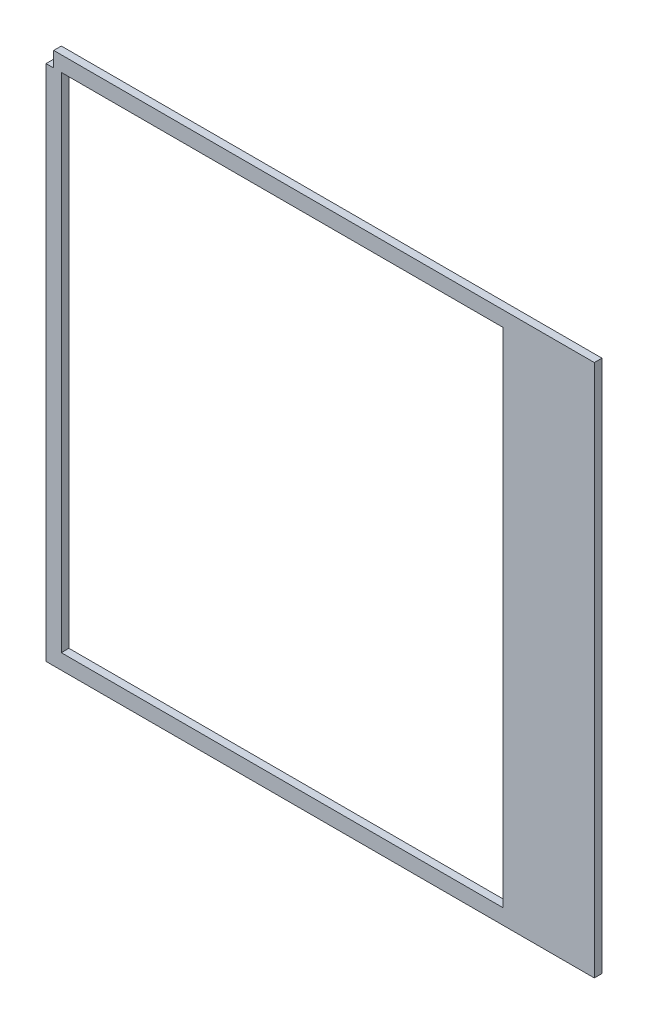
ISO-10303-21;
HEADER;
FILE_DESCRIPTION(('STEP AP214'),'2;1');
FILE_NAME('part.step','',(''),(''),'','','');
FILE_SCHEMA(('AUTOMOTIVE_DESIGN { 1 0 10303 214 1 1 1 1 }'));
ENDSEC;
DATA;
#1=APPLICATION_CONTEXT('core data for automotive mechanical design processes');
#2=APPLICATION_PROTOCOL_DEFINITION('international standard','automotive_design',2000,#1);
#3=PRODUCT_CONTEXT('',#1,'mechanical');
#4=PRODUCT('Part','Part','',(#3));
#5=PRODUCT_RELATED_PRODUCT_CATEGORY('part','',(#4));
#6=PRODUCT_DEFINITION_FORMATION('','',#4);
#7=PRODUCT_DEFINITION_CONTEXT('part definition',#1,'design');
#8=PRODUCT_DEFINITION('design','',#6,#7);
#9=PRODUCT_DEFINITION_SHAPE('','',#8);
#10=(LENGTH_UNIT() NAMED_UNIT(*) SI_UNIT(.MILLI.,.METRE.));
#11=(NAMED_UNIT(*) PLANE_ANGLE_UNIT() SI_UNIT($,.RADIAN.));
#12=(NAMED_UNIT(*) SI_UNIT($,.STERADIAN.) SOLID_ANGLE_UNIT());
#13=UNCERTAINTY_MEASURE_WITH_UNIT(LENGTH_MEASURE(1.E-05),#10,'distance_accuracy_value','');
#14=(GEOMETRIC_REPRESENTATION_CONTEXT(3) GLOBAL_UNCERTAINTY_ASSIGNED_CONTEXT((#13)) GLOBAL_UNIT_ASSIGNED_CONTEXT((#10,
#11,#12)) REPRESENTATION_CONTEXT('',''));
#15=CARTESIAN_POINT('',(0.,0.,0.));
#16=DIRECTION('',(0.,0.,1.));
#17=DIRECTION('',(1.,0.,0.));
#18=AXIS2_PLACEMENT_3D('',#15,#16,#17);
#19=CARTESIAN_POINT('',(0.,0.,5.));
#20=DIRECTION('',(0.,0.,1.));
#21=DIRECTION('',(1.,0.,0.));
#22=AXIS2_PLACEMENT_3D('',#19,#20,#21);
#23=PLANE('',#22);
#24=DIRECTION('',(0.,1.,0.));
#25=VECTOR('',#24,1.);
#26=CARTESIAN_POINT('',(198.485722832852,244.450688951835,5.));
#27=LINE('',#26,#25);
#28=CARTESIAN_POINT('',(198.485722832852,-105.549311048165,5.));
#29=VERTEX_POINT('',#28);
#30=CARTESIAN_POINT('',(198.485722832852,244.450688951835,5.));
#31=VERTEX_POINT('',#30);
#32=EDGE_CURVE('E145',#29,#31,#27,.T.);
#33=ORIENTED_EDGE('',*,*,#32,.T.);
#34=DIRECTION('',(-1.,0.,0.));
#35=VECTOR('',#34,1.);
#36=CARTESIAN_POINT('',(-156.514277167148,244.450688951835,5.));
#37=LINE('',#36,#35);
#38=CARTESIAN_POINT('',(-156.514277167148,244.450688951835,5.));
#39=VERTEX_POINT('',#38);
#40=EDGE_CURVE('E148',#31,#39,#37,.T.);
#41=ORIENTED_EDGE('',*,*,#40,.T.);
#42=DIRECTION('',(0.,-1.,0.));
#43=VECTOR('',#42,1.);
#44=CARTESIAN_POINT('',(-156.514277167148,234.450688951835,5.));
#45=LINE('',#44,#43);
#46=CARTESIAN_POINT('',(-156.514277167148,234.450688951835,5.));
#47=VERTEX_POINT('',#46);
#48=EDGE_CURVE('E151',#39,#47,#45,.T.);
#49=ORIENTED_EDGE('',*,*,#48,.T.);
#50=DIRECTION('',(-1.,0.,0.));
#51=VECTOR('',#50,1.);
#52=CARTESIAN_POINT('',(-161.514277167148,234.450688951835,5.));
#53=LINE('',#52,#51);
#54=CARTESIAN_POINT('',(-161.514277167148,234.450688951835,5.));
#55=VERTEX_POINT('',#54);
#56=EDGE_CURVE('E153',#47,#55,#53,.T.);
#57=ORIENTED_EDGE('',*,*,#56,.T.);
#58=DIRECTION('',(0.,-1.,0.));
#59=VECTOR('',#58,1.);
#60=CARTESIAN_POINT('',(-161.514277167148,234.450688951835,5.));
#61=LINE('',#60,#59);
#62=CARTESIAN_POINT('',(-161.514277167148,-105.549311048165,5.));
#63=VERTEX_POINT('',#62);
#64=EDGE_CURVE('E155',#55,#63,#61,.T.);
#65=ORIENTED_EDGE('',*,*,#64,.T.);
#66=DIRECTION('',(1.,0.,0.));
#67=VECTOR('',#66,1.);
#68=CARTESIAN_POINT('',(-161.514277167148,-105.549311048165,5.));
#69=LINE('',#68,#67);
#70=EDGE_CURVE('E157',#63,#29,#69,.T.);
#71=ORIENTED_EDGE('',*,*,#70,.T.);
#72=EDGE_LOOP('',(#33,#41,#49,#57,#65,#71));
#73=FACE_BOUND('',#72,.T.);
#74=DIRECTION('',(1.,0.,0.));
#75=VECTOR('',#74,1.);
#76=CARTESIAN_POINT('',(-151.514277167148,-95.5493110481646,5.));
#77=LINE('',#76,#75);
#78=CARTESIAN_POINT('',(-151.514277167148,-95.5493110481646,5.));
#79=VERTEX_POINT('',#78);
#80=CARTESIAN_POINT('',(138.485722832852,-95.5493110481646,5.));
#81=VERTEX_POINT('',#80);
#82=EDGE_CURVE('E117',#79,#81,#77,.T.);
#83=ORIENTED_EDGE('',*,*,#82,.F.);
#84=DIRECTION('',(0.,-1.,0.));
#85=VECTOR('',#84,1.);
#86=CARTESIAN_POINT('',(-151.514277167148,-95.5493110481646,5.));
#87=LINE('',#86,#85);
#88=CARTESIAN_POINT('',(-151.514277167148,234.450688951835,5.));
#89=VERTEX_POINT('',#88);
#90=EDGE_CURVE('E109',#89,#79,#87,.T.);
#91=ORIENTED_EDGE('',*,*,#90,.F.);
#92=DIRECTION('',(-1.,0.,0.));
#93=VECTOR('',#92,1.);
#94=CARTESIAN_POINT('',(-151.514277167148,234.450688951835,5.));
#95=LINE('',#94,#93);
#96=CARTESIAN_POINT('',(138.485722832852,234.450688951835,5.));
#97=VERTEX_POINT('',#96);
#98=EDGE_CURVE('E131',#97,#89,#95,.T.);
#99=ORIENTED_EDGE('',*,*,#98,.F.);
#100=DIRECTION('',(0.,1.,0.));
#101=VECTOR('',#100,1.);
#102=CARTESIAN_POINT('',(138.485722832852,-95.5493110481646,5.));
#103=LINE('',#102,#101);
#104=EDGE_CURVE('E129',#81,#97,#103,.T.);
#105=ORIENTED_EDGE('',*,*,#104,.F.);
#106=EDGE_LOOP('',(#83,#91,#99,#105));
#107=FACE_BOUND('',#106,.T.);
#108=ADVANCED_FACE('F32',(#73,#107),#23,.T.);
#109=CARTESIAN_POINT('',(0.,0.,0.));
#110=DIRECTION('',(0.,0.,1.));
#111=DIRECTION('',(1.,0.,0.));
#112=AXIS2_PLACEMENT_3D('',#109,#110,#111);
#113=PLANE('',#112);
#114=DIRECTION('',(0.,1.,0.));
#115=VECTOR('',#114,1.);
#116=CARTESIAN_POINT('',(198.485722832852,244.450688951835,0.));
#117=LINE('',#116,#115);
#118=CARTESIAN_POINT('',(198.485722832852,-105.549311048165,0.));
#119=VERTEX_POINT('',#118);
#120=CARTESIAN_POINT('',(198.485722832852,244.450688951835,0.));
#121=VERTEX_POINT('',#120);
#122=EDGE_CURVE('E125',#119,#121,#117,.T.);
#123=ORIENTED_EDGE('',*,*,#122,.F.);
#124=DIRECTION('',(1.,0.,0.));
#125=VECTOR('',#124,1.);
#126=CARTESIAN_POINT('',(-161.514277167148,-105.549311048165,0.));
#127=LINE('',#126,#125);
#128=CARTESIAN_POINT('',(-161.514277167148,-105.549311048165,0.));
#129=VERTEX_POINT('',#128);
#130=EDGE_CURVE('E149',#129,#119,#127,.T.);
#131=ORIENTED_EDGE('',*,*,#130,.F.);
#132=DIRECTION('',(0.,-1.,0.));
#133=VECTOR('',#132,1.);
#134=CARTESIAN_POINT('',(-161.514277167148,234.450688951835,0.));
#135=LINE('',#134,#133);
#136=CARTESIAN_POINT('',(-161.514277167148,234.450688951835,0.));
#137=VERTEX_POINT('',#136);
#138=EDGE_CURVE('E168',#137,#129,#135,.T.);
#139=ORIENTED_EDGE('',*,*,#138,.F.);
#140=DIRECTION('',(-1.,0.,0.));
#141=VECTOR('',#140,1.);
#142=CARTESIAN_POINT('',(-161.514277167148,234.450688951835,0.));
#143=LINE('',#142,#141);
#144=CARTESIAN_POINT('',(-156.514277167148,234.450688951835,0.));
#145=VERTEX_POINT('',#144);
#146=EDGE_CURVE('E166',#145,#137,#143,.T.);
#147=ORIENTED_EDGE('',*,*,#146,.F.);
#148=DIRECTION('',(0.,-1.,0.));
#149=VECTOR('',#148,1.);
#150=CARTESIAN_POINT('',(-156.514277167148,234.450688951835,0.));
#151=LINE('',#150,#149);
#152=CARTESIAN_POINT('',(-156.514277167148,244.450688951835,0.));
#153=VERTEX_POINT('',#152);
#154=EDGE_CURVE('E164',#153,#145,#151,.T.);
#155=ORIENTED_EDGE('',*,*,#154,.F.);
#156=DIRECTION('',(-1.,0.,0.));
#157=VECTOR('',#156,1.);
#158=CARTESIAN_POINT('',(-156.514277167148,244.450688951835,0.));
#159=LINE('',#158,#157);
#160=EDGE_CURVE('E162',#121,#153,#159,.T.);
#161=ORIENTED_EDGE('',*,*,#160,.F.);
#162=EDGE_LOOP('',(#123,#131,#139,#147,#155,#161));
#163=FACE_BOUND('',#162,.T.);
#164=DIRECTION('',(0.,-1.,0.));
#165=VECTOR('',#164,1.);
#166=CARTESIAN_POINT('',(-151.514277167148,-95.5493110481646,0.));
#167=LINE('',#166,#165);
#168=CARTESIAN_POINT('',(-151.514277167148,234.450688951835,0.));
#169=VERTEX_POINT('',#168);
#170=CARTESIAN_POINT('',(-151.514277167148,-95.5493110481646,0.));
#171=VERTEX_POINT('',#170);
#172=EDGE_CURVE('E55',#169,#171,#167,.T.);
#173=ORIENTED_EDGE('',*,*,#172,.T.);
#174=DIRECTION('',(1.,0.,0.));
#175=VECTOR('',#174,1.);
#176=CARTESIAN_POINT('',(-151.514277167148,-95.5493110481646,0.));
#177=LINE('',#176,#175);
#178=CARTESIAN_POINT('',(138.485722832852,-95.5493110481646,0.));
#179=VERTEX_POINT('',#178);
#180=EDGE_CURVE('E124',#171,#179,#177,.T.);
#181=ORIENTED_EDGE('',*,*,#180,.T.);
#182=DIRECTION('',(0.,1.,0.));
#183=VECTOR('',#182,1.);
#184=CARTESIAN_POINT('',(138.485722832852,-95.5493110481646,0.));
#185=LINE('',#184,#183);
#186=CARTESIAN_POINT('',(138.485722832852,234.450688951835,0.));
#187=VERTEX_POINT('',#186);
#188=EDGE_CURVE('E137',#179,#187,#185,.T.);
#189=ORIENTED_EDGE('',*,*,#188,.T.);
#190=DIRECTION('',(-1.,0.,0.));
#191=VECTOR('',#190,1.);
#192=CARTESIAN_POINT('',(-151.514277167148,234.450688951835,0.));
#193=LINE('',#192,#191);
#194=EDGE_CURVE('E118',#187,#169,#193,.T.);
#195=ORIENTED_EDGE('',*,*,#194,.T.);
#196=EDGE_LOOP('',(#173,#181,#189,#195));
#197=FACE_BOUND('',#196,.T.);
#198=ADVANCED_FACE('F192',(#163,#197),#113,.F.);
#199=CARTESIAN_POINT('',(198.485722832852,244.450688951835,5.));
#200=DIRECTION('',(-1.,0.,0.));
#201=DIRECTION('',(0.,-1.,0.));
#202=AXIS2_PLACEMENT_3D('',#199,#200,#201);
#203=PLANE('',#202);
#204=ORIENTED_EDGE('',*,*,#122,.T.);
#205=DIRECTION('',(0.,0.,-1.));
#206=VECTOR('',#205,1.);
#207=CARTESIAN_POINT('',(198.485722832852,244.450688951835,5.));
#208=LINE('',#207,#206);
#209=EDGE_CURVE('E11',#31,#121,#208,.T.);
#210=ORIENTED_EDGE('',*,*,#209,.F.);
#211=ORIENTED_EDGE('',*,*,#32,.F.);
#212=DIRECTION('',(0.,0.,-1.));
#213=VECTOR('',#212,1.);
#214=CARTESIAN_POINT('',(198.485722832852,-105.549311048165,5.));
#215=LINE('',#214,#213);
#216=EDGE_CURVE('E159',#29,#119,#215,.T.);
#217=ORIENTED_EDGE('',*,*,#216,.T.);
#218=EDGE_LOOP('',(#204,#210,#211,#217));
#219=FACE_BOUND('',#218,.T.);
#220=ADVANCED_FACE('F34',(#219),#203,.F.);
#221=CARTESIAN_POINT('',(-156.514277167148,244.450688951835,5.));
#222=DIRECTION('',(0.,-1.,0.));
#223=DIRECTION('',(0.,0.,-1.));
#224=AXIS2_PLACEMENT_3D('',#221,#222,#223);
#225=PLANE('',#224);
#226=ORIENTED_EDGE('',*,*,#160,.T.);
#227=DIRECTION('',(0.,0.,-1.));
#228=VECTOR('',#227,1.);
#229=CARTESIAN_POINT('',(-156.514277167148,244.450688951835,5.));
#230=LINE('',#229,#228);
#231=EDGE_CURVE('E40',#39,#153,#230,.T.);
#232=ORIENTED_EDGE('',*,*,#231,.F.);
#233=ORIENTED_EDGE('',*,*,#40,.F.);
#234=ORIENTED_EDGE('',*,*,#209,.T.);
#235=EDGE_LOOP('',(#226,#232,#233,#234));
#236=FACE_BOUND('',#235,.T.);
#237=ADVANCED_FACE('F209',(#236),#225,.F.);
#238=CARTESIAN_POINT('',(-156.514277167148,234.450688951835,5.));
#239=DIRECTION('',(1.,0.,0.));
#240=DIRECTION('',(0.,0.,-1.));
#241=AXIS2_PLACEMENT_3D('',#238,#239,#240);
#242=PLANE('',#241);
#243=ORIENTED_EDGE('',*,*,#154,.T.);
#244=DIRECTION('',(0.,0.,-1.));
#245=VECTOR('',#244,1.);
#246=CARTESIAN_POINT('',(-156.514277167148,234.450688951835,5.));
#247=LINE('',#246,#245);
#248=EDGE_CURVE('E179',#47,#145,#247,.T.);
#249=ORIENTED_EDGE('',*,*,#248,.F.);
#250=ORIENTED_EDGE('',*,*,#48,.F.);
#251=ORIENTED_EDGE('',*,*,#231,.T.);
#252=EDGE_LOOP('',(#243,#249,#250,#251));
#253=FACE_BOUND('',#252,.T.);
#254=ADVANCED_FACE('F186',(#253),#242,.F.);
#255=CARTESIAN_POINT('',(-161.514277167148,234.450688951835,5.));
#256=DIRECTION('',(0.,-1.,0.));
#257=DIRECTION('',(0.,0.,-1.));
#258=AXIS2_PLACEMENT_3D('',#255,#256,#257);
#259=PLANE('',#258);
#260=ORIENTED_EDGE('',*,*,#146,.T.);
#261=DIRECTION('',(0.,0.,-1.));
#262=VECTOR('',#261,1.);
#263=CARTESIAN_POINT('',(-161.514277167148,234.450688951835,5.));
#264=LINE('',#263,#262);
#265=EDGE_CURVE('E176',#55,#137,#264,.T.);
#266=ORIENTED_EDGE('',*,*,#265,.F.);
#267=ORIENTED_EDGE('',*,*,#56,.F.);
#268=ORIENTED_EDGE('',*,*,#248,.T.);
#269=EDGE_LOOP('',(#260,#266,#267,#268));
#270=FACE_BOUND('',#269,.T.);
#271=ADVANCED_FACE('F198',(#270),#259,.F.);
#272=CARTESIAN_POINT('',(-161.514277167148,234.450688951835,5.));
#273=DIRECTION('',(1.,0.,0.));
#274=DIRECTION('',(0.,1.,0.));
#275=AXIS2_PLACEMENT_3D('',#272,#273,#274);
#276=PLANE('',#275);
#277=ORIENTED_EDGE('',*,*,#138,.T.);
#278=DIRECTION('',(0.,0.,-1.));
#279=VECTOR('',#278,1.);
#280=CARTESIAN_POINT('',(-161.514277167148,-105.549311048165,5.));
#281=LINE('',#280,#279);
#282=EDGE_CURVE('E173',#63,#129,#281,.T.);
#283=ORIENTED_EDGE('',*,*,#282,.F.);
#284=ORIENTED_EDGE('',*,*,#64,.F.);
#285=ORIENTED_EDGE('',*,*,#265,.T.);
#286=EDGE_LOOP('',(#277,#283,#284,#285));
#287=FACE_BOUND('',#286,.T.);
#288=ADVANCED_FACE('F202',(#287),#276,.F.);
#289=CARTESIAN_POINT('',(-161.514277167148,-105.549311048165,5.));
#290=DIRECTION('',(0.,1.,0.));
#291=DIRECTION('',(0.,0.,1.));
#292=AXIS2_PLACEMENT_3D('',#289,#290,#291);
#293=PLANE('',#292);
#294=ORIENTED_EDGE('',*,*,#130,.T.);
#295=ORIENTED_EDGE('',*,*,#216,.F.);
#296=ORIENTED_EDGE('',*,*,#70,.F.);
#297=ORIENTED_EDGE('',*,*,#282,.T.);
#298=EDGE_LOOP('',(#294,#295,#296,#297));
#299=FACE_BOUND('',#298,.T.);
#300=ADVANCED_FACE('F212',(#299),#293,.F.);
#301=CARTESIAN_POINT('',(-151.514277167148,-95.5493110481646,5.));
#302=DIRECTION('',(1.,0.,0.));
#303=DIRECTION('',(0.,0.,-1.));
#304=AXIS2_PLACEMENT_3D('',#301,#302,#303);
#305=PLANE('',#304);
#306=ORIENTED_EDGE('',*,*,#172,.F.);
#307=DIRECTION('',(0.,0.,-1.));
#308=VECTOR('',#307,1.);
#309=CARTESIAN_POINT('',(-151.514277167148,234.450688951835,5.));
#310=LINE('',#309,#308);
#311=EDGE_CURVE('E113',#89,#169,#310,.T.);
#312=ORIENTED_EDGE('',*,*,#311,.F.);
#313=ORIENTED_EDGE('',*,*,#90,.T.);
#314=DIRECTION('',(0.,0.,-1.));
#315=VECTOR('',#314,1.);
#316=CARTESIAN_POINT('',(-151.514277167148,-95.5493110481646,5.));
#317=LINE('',#316,#315);
#318=EDGE_CURVE('E112',#79,#171,#317,.T.);
#319=ORIENTED_EDGE('',*,*,#318,.T.);
#320=EDGE_LOOP('',(#306,#312,#313,#319));
#321=FACE_BOUND('',#320,.T.);
#322=ADVANCED_FACE('F111',(#321),#305,.T.);
#323=CARTESIAN_POINT('',(-151.514277167148,-95.5493110481646,5.));
#324=DIRECTION('',(0.,1.,0.));
#325=DIRECTION('',(0.,0.,1.));
#326=AXIS2_PLACEMENT_3D('',#323,#324,#325);
#327=PLANE('',#326);
#328=ORIENTED_EDGE('',*,*,#180,.F.);
#329=ORIENTED_EDGE('',*,*,#318,.F.);
#330=ORIENTED_EDGE('',*,*,#82,.T.);
#331=DIRECTION('',(0.,0.,-1.));
#332=VECTOR('',#331,1.);
#333=CARTESIAN_POINT('',(138.485722832852,-95.5493110481646,5.));
#334=LINE('',#333,#332);
#335=EDGE_CURVE('E126',#81,#179,#334,.T.);
#336=ORIENTED_EDGE('',*,*,#335,.T.);
#337=EDGE_LOOP('',(#328,#329,#330,#336));
#338=FACE_BOUND('',#337,.T.);
#339=ADVANCED_FACE('F121',(#338),#327,.T.);
#340=CARTESIAN_POINT('',(138.485722832852,-95.5493110481646,5.));
#341=DIRECTION('',(-1.,0.,0.));
#342=DIRECTION('',(0.,0.,1.));
#343=AXIS2_PLACEMENT_3D('',#340,#341,#342);
#344=PLANE('',#343);
#345=ORIENTED_EDGE('',*,*,#188,.F.);
#346=ORIENTED_EDGE('',*,*,#335,.F.);
#347=ORIENTED_EDGE('',*,*,#104,.T.);
#348=DIRECTION('',(0.,0.,-1.));
#349=VECTOR('',#348,1.);
#350=CARTESIAN_POINT('',(138.485722832852,234.450688951835,5.));
#351=LINE('',#350,#349);
#352=EDGE_CURVE('E47',#97,#187,#351,.T.);
#353=ORIENTED_EDGE('',*,*,#352,.T.);
#354=EDGE_LOOP('',(#345,#346,#347,#353));
#355=FACE_BOUND('',#354,.T.);
#356=ADVANCED_FACE('F230',(#355),#344,.T.);
#357=CARTESIAN_POINT('',(-151.514277167148,234.450688951835,5.));
#358=DIRECTION('',(0.,-1.,0.));
#359=DIRECTION('',(0.,0.,-1.));
#360=AXIS2_PLACEMENT_3D('',#357,#358,#359);
#361=PLANE('',#360);
#362=ORIENTED_EDGE('',*,*,#194,.F.);
#363=ORIENTED_EDGE('',*,*,#352,.F.);
#364=ORIENTED_EDGE('',*,*,#98,.T.);
#365=ORIENTED_EDGE('',*,*,#311,.T.);
#366=EDGE_LOOP('',(#362,#363,#364,#365));
#367=FACE_BOUND('',#366,.T.);
#368=ADVANCED_FACE('F233',(#367),#361,.T.);
#369=CLOSED_SHELL('',(#108,#198,#220,#237,#254,#271,#288,#300,#322,#339,#356,#368));
#370=MANIFOLD_SOLID_BREP('B2',#369);
#371=ADVANCED_BREP_SHAPE_REPRESENTATION('',(#18,#370),#14);
#372=SHAPE_DEFINITION_REPRESENTATION(#9,#371);
ENDSEC;
END-ISO-10303-21;
